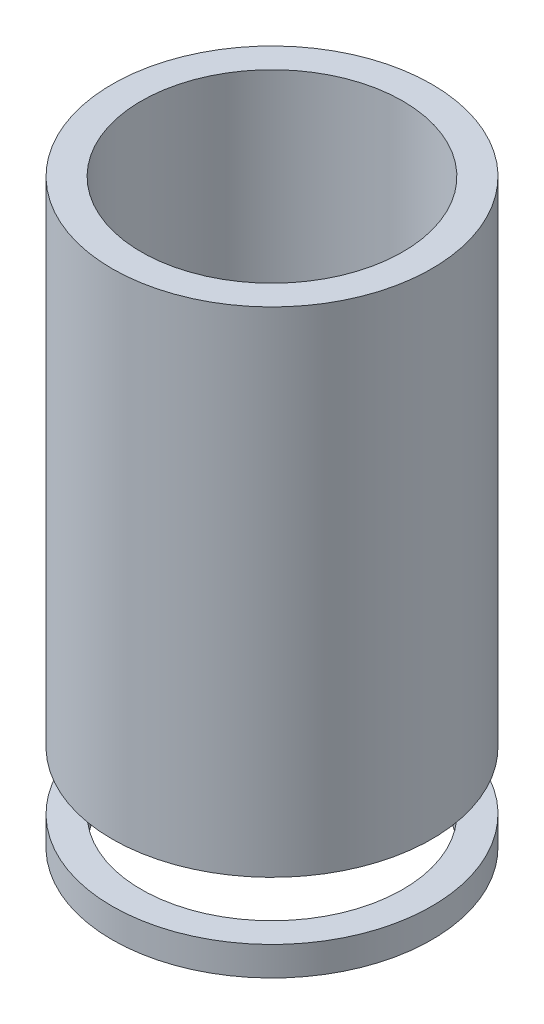
ISO-10303-21;
HEADER;
FILE_DESCRIPTION(('STEP AP214'),'2;1');
FILE_NAME('part.step','',(''),(''),'','','');
FILE_SCHEMA(('AUTOMOTIVE_DESIGN { 1 0 10303 214 1 1 1 1 }'));
ENDSEC;
DATA;
#1=APPLICATION_CONTEXT('core data for automotive mechanical design processes');
#2=APPLICATION_PROTOCOL_DEFINITION('international standard','automotive_design',2000,#1);
#3=PRODUCT_CONTEXT('',#1,'mechanical');
#4=PRODUCT('Part','Part','',(#3));
#5=PRODUCT_RELATED_PRODUCT_CATEGORY('part','',(#4));
#6=PRODUCT_DEFINITION_FORMATION('','',#4);
#7=PRODUCT_DEFINITION_CONTEXT('part definition',#1,'design');
#8=PRODUCT_DEFINITION('design','',#6,#7);
#9=PRODUCT_DEFINITION_SHAPE('','',#8);
#10=(LENGTH_UNIT() NAMED_UNIT(*) SI_UNIT(.MILLI.,.METRE.));
#11=(NAMED_UNIT(*) PLANE_ANGLE_UNIT() SI_UNIT($,.RADIAN.));
#12=(NAMED_UNIT(*) SI_UNIT($,.STERADIAN.) SOLID_ANGLE_UNIT());
#13=UNCERTAINTY_MEASURE_WITH_UNIT(LENGTH_MEASURE(1.E-05),#10,'distance_accuracy_value','');
#14=(GEOMETRIC_REPRESENTATION_CONTEXT(3) GLOBAL_UNCERTAINTY_ASSIGNED_CONTEXT((#13)) GLOBAL_UNIT_ASSIGNED_CONTEXT((#10,
#11,#12)) REPRESENTATION_CONTEXT('',''));
#15=CARTESIAN_POINT('',(0.,0.,0.));
#16=DIRECTION('',(0.,0.,1.));
#17=DIRECTION('',(1.,0.,0.));
#18=AXIS2_PLACEMENT_3D('',#15,#16,#17);
#19=CARTESIAN_POINT('',(0.,-110.603092707212,0.));
#20=DIRECTION('',(0.,-1.,0.));
#21=DIRECTION('',(0.,0.,-1.));
#22=AXIS2_PLACEMENT_3D('',#19,#20,#21);
#23=CYLINDRICAL_SURFACE('',#22,44.9999999999999);
#24=CARTESIAN_POINT('',(0.,-90.,0.));
#25=DIRECTION('',(0.,-1.,0.));
#26=DIRECTION('',(0.,0.,-1.));
#27=AXIS2_PLACEMENT_3D('',#24,#25,#26);
#28=CIRCLE('',#27,44.9999999999999);
#29=CARTESIAN_POINT('',(0.,-90.,-44.9999999999999));
#30=VERTEX_POINT('',#29);
#31=EDGE_CURVE('E64',#30,#30,#28,.F.);
#32=ORIENTED_EDGE('',*,*,#31,.T.);
#33=EDGE_LOOP('',(#32));
#34=FACE_BOUND('',#33,.T.);
#35=CARTESIAN_POINT('',(0.,-100.,0.));
#36=DIRECTION('',(0.,-1.,0.));
#37=DIRECTION('',(0.,0.,-1.));
#38=AXIS2_PLACEMENT_3D('',#35,#36,#37);
#39=CIRCLE('',#38,44.9999999999999);
#40=CARTESIAN_POINT('',(0.,-100.,-44.9999999999999));
#41=VERTEX_POINT('',#40);
#42=EDGE_CURVE('E59',#41,#41,#39,.T.);
#43=ORIENTED_EDGE('',*,*,#42,.T.);
#44=EDGE_LOOP('',(#43));
#45=FACE_BOUND('',#44,.T.);
#46=ADVANCED_FACE('F48',(#34,#45),#23,.F.);
#47=CARTESIAN_POINT('',(44.9999999999999,-100.,0.));
#48=DIRECTION('',(0.,-1.,0.));
#49=DIRECTION('',(0.,0.,-1.));
#50=AXIS2_PLACEMENT_3D('',#47,#48,#49);
#51=PLANE('',#50);
#52=CARTESIAN_POINT('',(0.,-100.,0.));
#53=DIRECTION('',(0.,-1.,0.));
#54=DIRECTION('',(0.,0.,-1.));
#55=AXIS2_PLACEMENT_3D('',#52,#53,#54);
#56=CIRCLE('',#55,54.9999999999999);
#57=CARTESIAN_POINT('',(0.,-100.,-54.9999999999999));
#58=VERTEX_POINT('',#57);
#59=EDGE_CURVE('E55',#58,#58,#56,.T.);
#60=ORIENTED_EDGE('',*,*,#59,.T.);
#61=EDGE_LOOP('',(#60));
#62=FACE_BOUND('',#61,.T.);
#63=ORIENTED_EDGE('',*,*,#42,.F.);
#64=EDGE_LOOP('',(#63));
#65=FACE_BOUND('',#64,.T.);
#66=ADVANCED_FACE('F78',(#62,#65),#51,.T.);
#67=CARTESIAN_POINT('',(0.,-110.603092707212,0.));
#68=DIRECTION('',(0.,-1.,0.));
#69=DIRECTION('',(0.,0.,-1.));
#70=AXIS2_PLACEMENT_3D('',#67,#68,#69);
#71=CYLINDRICAL_SURFACE('',#70,54.9999999999999);
#72=CARTESIAN_POINT('',(0.,-90.,0.));
#73=DIRECTION('',(0.,-1.,0.));
#74=DIRECTION('',(0.,0.,-1.));
#75=AXIS2_PLACEMENT_3D('',#72,#73,#74);
#76=CIRCLE('',#75,54.9999999999999);
#77=CARTESIAN_POINT('',(0.,-90.,-54.9999999999999));
#78=VERTEX_POINT('',#77);
#79=EDGE_CURVE('E11',#78,#78,#76,.T.);
#80=ORIENTED_EDGE('',*,*,#79,.T.);
#81=EDGE_LOOP('',(#80));
#82=FACE_BOUND('',#81,.T.);
#83=ORIENTED_EDGE('',*,*,#59,.F.);
#84=EDGE_LOOP('',(#83));
#85=FACE_BOUND('',#84,.T.);
#86=ADVANCED_FACE('F50',(#82,#85),#71,.T.);
#87=CARTESIAN_POINT('',(44.9999999999999,-90.,0.));
#88=DIRECTION('',(0.,-1.,0.));
#89=DIRECTION('',(0.,0.,-1.));
#90=AXIS2_PLACEMENT_3D('',#87,#88,#89);
#91=PLANE('',#90);
#92=ORIENTED_EDGE('',*,*,#79,.F.);
#93=EDGE_LOOP('',(#92));
#94=FACE_BOUND('',#93,.T.);
#95=ORIENTED_EDGE('',*,*,#31,.F.);
#96=EDGE_LOOP('',(#95));
#97=FACE_BOUND('',#96,.T.);
#98=ADVANCED_FACE('F71',(#94,#97),#91,.F.);
#99=CLOSED_SHELL('',(#46,#66,#86,#98));
#100=MANIFOLD_SOLID_BREP('B2',#99);
#101=CARTESIAN_POINT('',(0.,-110.603092707212,0.));
#102=DIRECTION('',(0.,-1.,0.));
#103=DIRECTION('',(0.,0.,-1.));
#104=AXIS2_PLACEMENT_3D('',#101,#102,#103);
#105=CYLINDRICAL_SURFACE('',#104,44.9999999999999);
#106=CARTESIAN_POINT('',(0.,100.,0.));
#107=DIRECTION('',(0.,-1.,0.));
#108=DIRECTION('',(0.,0.,-1.));
#109=AXIS2_PLACEMENT_3D('',#106,#107,#108);
#110=CIRCLE('',#109,44.9999999999999);
#111=CARTESIAN_POINT('',(0.,100.,-44.9999999999999));
#112=VERTEX_POINT('',#111);
#113=EDGE_CURVE('E117',#112,#112,#110,.T.);
#114=ORIENTED_EDGE('',*,*,#113,.F.);
#115=EDGE_LOOP('',(#114));
#116=FACE_BOUND('',#115,.T.);
#117=CARTESIAN_POINT('',(0.,-70.,0.));
#118=DIRECTION('',(0.,-1.,0.));
#119=DIRECTION('',(0.,0.,-1.));
#120=AXIS2_PLACEMENT_3D('',#117,#118,#119);
#121=CIRCLE('',#120,44.9999999999999);
#122=CARTESIAN_POINT('',(0.,-70.,-44.9999999999999));
#123=VERTEX_POINT('',#122);
#124=EDGE_CURVE('E121',#123,#123,#121,.F.);
#125=ORIENTED_EDGE('',*,*,#124,.F.);
#126=EDGE_LOOP('',(#125));
#127=FACE_BOUND('',#126,.T.);
#128=ADVANCED_FACE('F111',(#116,#127),#105,.F.);
#129=CARTESIAN_POINT('',(44.9999999999999,100.,0.));
#130=DIRECTION('',(0.,1.,0.));
#131=DIRECTION('',(0.,0.,1.));
#132=AXIS2_PLACEMENT_3D('',#129,#130,#131);
#133=PLANE('',#132);
#134=ORIENTED_EDGE('',*,*,#113,.T.);
#135=EDGE_LOOP('',(#134));
#136=FACE_BOUND('',#135,.T.);
#137=CARTESIAN_POINT('',(0.,100.,0.));
#138=DIRECTION('',(0.,-1.,0.));
#139=DIRECTION('',(0.,0.,-1.));
#140=AXIS2_PLACEMENT_3D('',#137,#138,#139);
#141=CIRCLE('',#140,54.9999999999999);
#142=CARTESIAN_POINT('',(0.,100.,-54.9999999999999));
#143=VERTEX_POINT('',#142);
#144=EDGE_CURVE('E47',#143,#143,#141,.T.);
#145=ORIENTED_EDGE('',*,*,#144,.F.);
#146=EDGE_LOOP('',(#145));
#147=FACE_BOUND('',#146,.T.);
#148=ADVANCED_FACE('F136',(#136,#147),#133,.T.);
#149=CARTESIAN_POINT('',(0.,-110.603092707212,0.));
#150=DIRECTION('',(0.,-1.,0.));
#151=DIRECTION('',(0.,0.,-1.));
#152=AXIS2_PLACEMENT_3D('',#149,#150,#151);
#153=CYLINDRICAL_SURFACE('',#152,54.9999999999999);
#154=ORIENTED_EDGE('',*,*,#144,.T.);
#155=EDGE_LOOP('',(#154));
#156=FACE_BOUND('',#155,.T.);
#157=CARTESIAN_POINT('',(0.,-70.,0.));
#158=DIRECTION('',(0.,-1.,0.));
#159=DIRECTION('',(0.,0.,-1.));
#160=AXIS2_PLACEMENT_3D('',#157,#158,#159);
#161=CIRCLE('',#160,54.9999999999999);
#162=CARTESIAN_POINT('',(0.,-70.,-54.9999999999999));
#163=VERTEX_POINT('',#162);
#164=EDGE_CURVE('E125',#163,#163,#161,.T.);
#165=ORIENTED_EDGE('',*,*,#164,.F.);
#166=EDGE_LOOP('',(#165));
#167=FACE_BOUND('',#166,.T.);
#168=ADVANCED_FACE('F134',(#156,#167),#153,.T.);
#169=CARTESIAN_POINT('',(44.9999999999999,-70.,0.));
#170=DIRECTION('',(0.,-1.,0.));
#171=DIRECTION('',(0.,0.,-1.));
#172=AXIS2_PLACEMENT_3D('',#169,#170,#171);
#173=PLANE('',#172);
#174=ORIENTED_EDGE('',*,*,#164,.T.);
#175=EDGE_LOOP('',(#174));
#176=FACE_BOUND('',#175,.T.);
#177=ORIENTED_EDGE('',*,*,#124,.T.);
#178=EDGE_LOOP('',(#177));
#179=FACE_BOUND('',#178,.T.);
#180=ADVANCED_FACE('F131',(#176,#179),#173,.T.);
#181=CLOSED_SHELL('',(#128,#148,#168,#180));
#182=MANIFOLD_SOLID_BREP('B6',#181);
#183=ADVANCED_BREP_SHAPE_REPRESENTATION('',(#18,#100,#182),#14);
#184=SHAPE_DEFINITION_REPRESENTATION(#9,#183);
ENDSEC;
END-ISO-10303-21;
